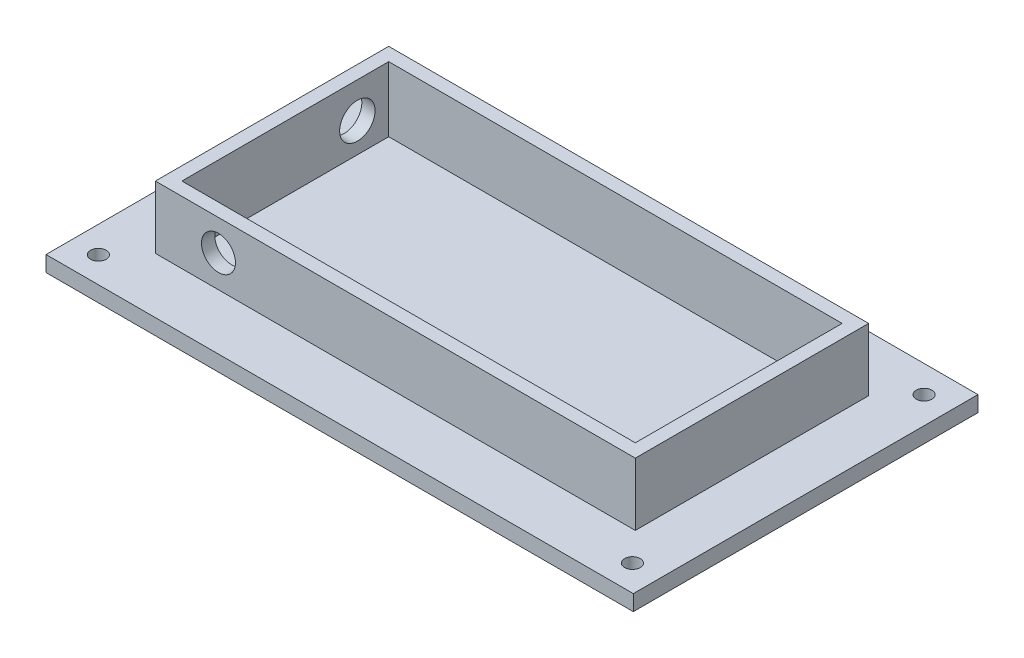
ISO-10303-21;
HEADER;
FILE_DESCRIPTION(('STEP AP214'),'2;1');
FILE_NAME('part.step','',(''),(''),'','','');
FILE_SCHEMA(('AUTOMOTIVE_DESIGN { 1 0 10303 214 1 1 1 1 }'));
ENDSEC;
DATA;
#1=APPLICATION_CONTEXT('core data for automotive mechanical design processes');
#2=APPLICATION_PROTOCOL_DEFINITION('international standard','automotive_design',2000,#1);
#3=PRODUCT_CONTEXT('',#1,'mechanical');
#4=PRODUCT('Part','Part','',(#3));
#5=PRODUCT_RELATED_PRODUCT_CATEGORY('part','',(#4));
#6=PRODUCT_DEFINITION_FORMATION('','',#4);
#7=PRODUCT_DEFINITION_CONTEXT('part definition',#1,'design');
#8=PRODUCT_DEFINITION('design','',#6,#7);
#9=PRODUCT_DEFINITION_SHAPE('','',#8);
#10=(LENGTH_UNIT() NAMED_UNIT(*) SI_UNIT(.MILLI.,.METRE.));
#11=(NAMED_UNIT(*) PLANE_ANGLE_UNIT() SI_UNIT($,.RADIAN.));
#12=(NAMED_UNIT(*) SI_UNIT($,.STERADIAN.) SOLID_ANGLE_UNIT());
#13=UNCERTAINTY_MEASURE_WITH_UNIT(LENGTH_MEASURE(1.E-05),#10,'distance_accuracy_value','');
#14=(GEOMETRIC_REPRESENTATION_CONTEXT(3) GLOBAL_UNCERTAINTY_ASSIGNED_CONTEXT((#13)) GLOBAL_UNIT_ASSIGNED_CONTEXT((#10,
#11,#12)) REPRESENTATION_CONTEXT('',''));
#15=CARTESIAN_POINT('',(0.,0.,0.));
#16=DIRECTION('',(0.,0.,1.));
#17=DIRECTION('',(1.,0.,0.));
#18=AXIS2_PLACEMENT_3D('',#15,#16,#17);
#19=CARTESIAN_POINT('',(-2.61848637797424,2.75093189925061,-3.54869754294544));
#20=DIRECTION('',(0.,1.,0.));
#21=DIRECTION('',(0.,0.,1.));
#22=AXIS2_PLACEMENT_3D('',#19,#20,#21);
#23=PLANE('',#22);
#24=DIRECTION('',(0.,0.,1.));
#25=VECTOR('',#24,1.);
#26=CARTESIAN_POINT('',(-64.0915115578303,2.75093189925061,-26.4032155285569));
#27=LINE('',#26,#25);
#28=CARTESIAN_POINT('',(-64.0915115578303,2.75093189925061,-26.4032155285569));
#29=VERTEX_POINT('',#28);
#30=CARTESIAN_POINT('',(-64.0915115578303,2.75093189925061,40.6527844714431));
#31=VERTEX_POINT('',#30);
#32=EDGE_CURVE('E69',#29,#31,#27,.T.);
#33=ORIENTED_EDGE('',*,*,#32,.F.);
#34=DIRECTION('',(1.,0.,0.));
#35=VECTOR('',#34,1.);
#36=CARTESIAN_POINT('',(-64.0915115578303,2.75093189925061,-26.4032155285569));
#37=LINE('',#36,#35);
#38=CARTESIAN_POINT('',(73.8304884421697,2.75093189925061,-26.4032155285569));
#39=VERTEX_POINT('',#38);
#40=EDGE_CURVE('E179',#29,#39,#37,.T.);
#41=ORIENTED_EDGE('',*,*,#40,.T.);
#42=DIRECTION('',(0.,0.,1.));
#43=VECTOR('',#42,1.);
#44=CARTESIAN_POINT('',(73.8304884421697,2.75093189925061,-26.4032155285569));
#45=LINE('',#44,#43);
#46=CARTESIAN_POINT('',(73.8304884421697,2.75093189925061,40.6527844714431));
#47=VERTEX_POINT('',#46);
#48=EDGE_CURVE('E189',#39,#47,#45,.T.);
#49=ORIENTED_EDGE('',*,*,#48,.T.);
#50=DIRECTION('',(1.,0.,0.));
#51=VECTOR('',#50,1.);
#52=CARTESIAN_POINT('',(-64.0915115578303,2.75093189925061,40.6527844714431));
#53=LINE('',#52,#51);
#54=EDGE_CURVE('E190',#31,#47,#53,.T.);
#55=ORIENTED_EDGE('',*,*,#54,.F.);
#56=EDGE_LOOP('',(#33,#41,#49,#55));
#57=FACE_BOUND('',#56,.T.);
#58=CARTESIAN_POINT('',(81.5320645135622,2.75093189925061,-34.6384759327261));
#59=DIRECTION('',(0.,1.,0.));
#60=DIRECTION('',(0.,0.,1.));
#61=AXIS2_PLACEMENT_3D('',#58,#59,#60);
#62=CIRCLE('',#61,2.25000000000001);
#63=CARTESIAN_POINT('',(81.5320645135622,2.75093189925061,-32.3884759327261));
#64=VERTEX_POINT('',#63);
#65=EDGE_CURVE('E209',#64,#64,#62,.T.);
#66=ORIENTED_EDGE('',*,*,#65,.F.);
#67=EDGE_LOOP('',(#66));
#68=FACE_BOUND('',#67,.T.);
#69=CARTESIAN_POINT('',(-71.9300990252795,2.75093189925061,-34.6384759327261));
#70=DIRECTION('',(0.,1.,0.));
#71=DIRECTION('',(0.,0.,1.));
#72=AXIS2_PLACEMENT_3D('',#69,#70,#71);
#73=CIRCLE('',#72,2.25000000000001);
#74=CARTESIAN_POINT('',(-71.9300990252795,2.75093189925061,-32.3884759327261));
#75=VERTEX_POINT('',#74);
#76=EDGE_CURVE('E225',#75,#75,#73,.T.);
#77=ORIENTED_EDGE('',*,*,#76,.F.);
#78=EDGE_LOOP('',(#77));
#79=FACE_BOUND('',#78,.T.);
#80=DIRECTION('',(0.,0.,1.));
#81=VECTOR('',#80,1.);
#82=CARTESIAN_POINT('',(-79.5220115578304,2.75093189925061,-42.4052155285569));
#83=LINE('',#82,#81);
#84=CARTESIAN_POINT('',(-79.5220115578304,2.75093189925061,-42.4052155285569));
#85=VERTEX_POINT('',#84);
#86=CARTESIAN_POINT('',(-79.5220115578303,2.75093189925061,56.6547844714431));
#87=VERTEX_POINT('',#86);
#88=EDGE_CURVE('E227',#85,#87,#83,.T.);
#89=ORIENTED_EDGE('',*,*,#88,.T.);
#90=DIRECTION('',(1.,0.,0.));
#91=VECTOR('',#90,1.);
#92=CARTESIAN_POINT('',(-79.5220115578303,2.75093189925061,56.6547844714431));
#93=LINE('',#92,#91);
#94=CARTESIAN_POINT('',(89.2609884421697,2.75093189925061,56.6547844714431));
#95=VERTEX_POINT('',#94);
#96=EDGE_CURVE('E232',#87,#95,#93,.T.);
#97=ORIENTED_EDGE('',*,*,#96,.T.);
#98=DIRECTION('',(0.,0.,-1.));
#99=VECTOR('',#98,1.);
#100=CARTESIAN_POINT('',(89.2609884421696,2.75093189925061,-42.4052155285569));
#101=LINE('',#100,#99);
#102=CARTESIAN_POINT('',(89.2609884421696,2.75093189925061,-42.4052155285569));
#103=VERTEX_POINT('',#102);
#104=EDGE_CURVE('E231',#95,#103,#101,.T.);
#105=ORIENTED_EDGE('',*,*,#104,.T.);
#106=DIRECTION('',(-1.,0.,0.));
#107=VECTOR('',#106,1.);
#108=CARTESIAN_POINT('',(-79.5220115578304,2.75093189925061,-42.4052155285569));
#109=LINE('',#108,#107);
#110=EDGE_CURVE('E237',#103,#85,#109,.T.);
#111=ORIENTED_EDGE('',*,*,#110,.T.);
#112=EDGE_LOOP('',(#89,#97,#105,#111));
#113=FACE_BOUND('',#112,.T.);
#114=CARTESIAN_POINT('',(81.5320645135622,2.75093189925061,49.1851880048192));
#115=DIRECTION('',(0.,1.,0.));
#116=DIRECTION('',(0.,0.,1.));
#117=AXIS2_PLACEMENT_3D('',#114,#115,#116);
#118=CIRCLE('',#117,2.25000000000001);
#119=CARTESIAN_POINT('',(81.5320645135622,2.75093189925061,51.4351880048192));
#120=VERTEX_POINT('',#119);
#121=EDGE_CURVE('E216',#120,#120,#118,.T.);
#122=ORIENTED_EDGE('',*,*,#121,.F.);
#123=EDGE_LOOP('',(#122));
#124=FACE_BOUND('',#123,.T.);
#125=CARTESIAN_POINT('',(-71.9300990252795,2.75093189925061,49.1851880048192));
#126=DIRECTION('',(0.,1.,0.));
#127=DIRECTION('',(0.,0.,1.));
#128=AXIS2_PLACEMENT_3D('',#125,#126,#127);
#129=CIRCLE('',#128,2.25000000000001);
#130=CARTESIAN_POINT('',(-71.9300990252795,2.75093189925061,51.4351880048192));
#131=VERTEX_POINT('',#130);
#132=EDGE_CURVE('E204',#131,#131,#129,.T.);
#133=ORIENTED_EDGE('',*,*,#132,.F.);
#134=EDGE_LOOP('',(#133));
#135=FACE_BOUND('',#134,.T.);
#136=ADVANCED_FACE('F45',(#57,#68,#79,#113,#124,#135),#23,.T.);
#137=CARTESIAN_POINT('',(-2.61848637797424,-1.74906810074939,-3.54869754294544));
#138=DIRECTION('',(0.,1.,0.));
#139=DIRECTION('',(0.,0.,1.));
#140=AXIS2_PLACEMENT_3D('',#137,#138,#139);
#141=PLANE('',#140);
#142=DIRECTION('',(0.,0.,1.));
#143=VECTOR('',#142,1.);
#144=CARTESIAN_POINT('',(-79.5220115578304,-1.74906810074939,-42.4052155285569));
#145=LINE('',#144,#143);
#146=CARTESIAN_POINT('',(-79.5220115578304,-1.74906810074939,-42.4052155285569));
#147=VERTEX_POINT('',#146);
#148=CARTESIAN_POINT('',(-79.5220115578303,-1.74906810074939,56.6547844714431));
#149=VERTEX_POINT('',#148);
#150=EDGE_CURVE('E223',#147,#149,#145,.T.);
#151=ORIENTED_EDGE('',*,*,#150,.F.);
#152=DIRECTION('',(-1.,0.,0.));
#153=VECTOR('',#152,1.);
#154=CARTESIAN_POINT('',(-79.5220115578304,-1.74906810074939,-42.4052155285569));
#155=LINE('',#154,#153);
#156=CARTESIAN_POINT('',(89.2609884421696,-1.74906810074939,-42.4052155285569));
#157=VERTEX_POINT('',#156);
#158=EDGE_CURVE('E234',#157,#147,#155,.T.);
#159=ORIENTED_EDGE('',*,*,#158,.F.);
#160=DIRECTION('',(0.,0.,-1.));
#161=VECTOR('',#160,1.);
#162=CARTESIAN_POINT('',(89.2609884421696,-1.74906810074939,-42.4052155285569));
#163=LINE('',#162,#161);
#164=CARTESIAN_POINT('',(89.2609884421697,-1.74906810074939,56.6547844714431));
#165=VERTEX_POINT('',#164);
#166=EDGE_CURVE('E242',#165,#157,#163,.T.);
#167=ORIENTED_EDGE('',*,*,#166,.F.);
#168=DIRECTION('',(1.,0.,0.));
#169=VECTOR('',#168,1.);
#170=CARTESIAN_POINT('',(-79.5220115578303,-1.74906810074939,56.6547844714431));
#171=LINE('',#170,#169);
#172=EDGE_CURVE('E241',#149,#165,#171,.T.);
#173=ORIENTED_EDGE('',*,*,#172,.F.);
#174=EDGE_LOOP('',(#151,#159,#167,#173));
#175=FACE_BOUND('',#174,.T.);
#176=CARTESIAN_POINT('',(-71.9300990252795,-1.74906810074939,-34.6384759327261));
#177=DIRECTION('',(0.,1.,0.));
#178=DIRECTION('',(0.,0.,1.));
#179=AXIS2_PLACEMENT_3D('',#176,#177,#178);
#180=CIRCLE('',#179,2.25000000000001);
#181=CARTESIAN_POINT('',(-71.9300990252795,-1.74906810074939,-32.3884759327261));
#182=VERTEX_POINT('',#181);
#183=EDGE_CURVE('E218',#182,#182,#180,.T.);
#184=ORIENTED_EDGE('',*,*,#183,.T.);
#185=EDGE_LOOP('',(#184));
#186=FACE_BOUND('',#185,.T.);
#187=CARTESIAN_POINT('',(81.5320645135622,-1.74906810074939,49.1851880048192));
#188=DIRECTION('',(0.,1.,0.));
#189=DIRECTION('',(0.,0.,1.));
#190=AXIS2_PLACEMENT_3D('',#187,#188,#189);
#191=CIRCLE('',#190,2.25000000000001);
#192=CARTESIAN_POINT('',(81.5320645135622,-1.74906810074939,51.4351880048192));
#193=VERTEX_POINT('',#192);
#194=EDGE_CURVE('E213',#193,#193,#191,.T.);
#195=ORIENTED_EDGE('',*,*,#194,.T.);
#196=EDGE_LOOP('',(#195));
#197=FACE_BOUND('',#196,.T.);
#198=CARTESIAN_POINT('',(81.5320645135622,-1.74906810074939,-34.6384759327261));
#199=DIRECTION('',(0.,1.,0.));
#200=DIRECTION('',(0.,0.,1.));
#201=AXIS2_PLACEMENT_3D('',#198,#199,#200);
#202=CIRCLE('',#201,2.25000000000001);
#203=CARTESIAN_POINT('',(81.5320645135622,-1.74906810074939,-32.3884759327261));
#204=VERTEX_POINT('',#203);
#205=EDGE_CURVE('E210',#204,#204,#202,.T.);
#206=ORIENTED_EDGE('',*,*,#205,.T.);
#207=EDGE_LOOP('',(#206));
#208=FACE_BOUND('',#207,.T.);
#209=CARTESIAN_POINT('',(-71.9300990252795,-1.74906810074939,49.1851880048192));
#210=DIRECTION('',(0.,1.,0.));
#211=DIRECTION('',(0.,0.,1.));
#212=AXIS2_PLACEMENT_3D('',#209,#210,#211);
#213=CIRCLE('',#212,2.25000000000001);
#214=CARTESIAN_POINT('',(-71.9300990252795,-1.74906810074939,51.4351880048192));
#215=VERTEX_POINT('',#214);
#216=EDGE_CURVE('E201',#215,#215,#213,.T.);
#217=ORIENTED_EDGE('',*,*,#216,.T.);
#218=EDGE_LOOP('',(#217));
#219=FACE_BOUND('',#218,.T.);
#220=ADVANCED_FACE('F282',(#175,#186,#197,#208,#219),#141,.F.);
#221=CARTESIAN_POINT('',(-79.5220115578304,2.75093189925061,-42.4052155285569));
#222=DIRECTION('',(1.,0.,0.));
#223=DIRECTION('',(0.,0.,-1.));
#224=AXIS2_PLACEMENT_3D('',#221,#222,#223);
#225=PLANE('',#224);
#226=ORIENTED_EDGE('',*,*,#150,.T.);
#227=DIRECTION('',(0.,-1.,0.));
#228=VECTOR('',#227,1.);
#229=CARTESIAN_POINT('',(-79.5220115578303,2.75093189925061,56.6547844714431));
#230=LINE('',#229,#228);
#231=EDGE_CURVE('E12',#87,#149,#230,.T.);
#232=ORIENTED_EDGE('',*,*,#231,.F.);
#233=ORIENTED_EDGE('',*,*,#88,.F.);
#234=DIRECTION('',(0.,-1.,0.));
#235=VECTOR('',#234,1.);
#236=CARTESIAN_POINT('',(-79.5220115578304,2.75093189925061,-42.4052155285569));
#237=LINE('',#236,#235);
#238=EDGE_CURVE('E236',#85,#147,#237,.T.);
#239=ORIENTED_EDGE('',*,*,#238,.T.);
#240=EDGE_LOOP('',(#226,#232,#233,#239));
#241=FACE_BOUND('',#240,.T.);
#242=ADVANCED_FACE('F42',(#241),#225,.F.);
#243=CARTESIAN_POINT('',(-79.5220115578303,2.75093189925061,56.6547844714431));
#244=DIRECTION('',(0.,0.,-1.));
#245=DIRECTION('',(-1.,0.,0.));
#246=AXIS2_PLACEMENT_3D('',#243,#244,#245);
#247=PLANE('',#246);
#248=ORIENTED_EDGE('',*,*,#172,.T.);
#249=DIRECTION('',(0.,-1.,0.));
#250=VECTOR('',#249,1.);
#251=CARTESIAN_POINT('',(89.2609884421697,2.75093189925061,56.6547844714431));
#252=LINE('',#251,#250);
#253=EDGE_CURVE('E51',#95,#165,#252,.T.);
#254=ORIENTED_EDGE('',*,*,#253,.F.);
#255=ORIENTED_EDGE('',*,*,#96,.F.);
#256=ORIENTED_EDGE('',*,*,#231,.T.);
#257=EDGE_LOOP('',(#248,#254,#255,#256));
#258=FACE_BOUND('',#257,.T.);
#259=ADVANCED_FACE('F302',(#258),#247,.F.);
#260=CARTESIAN_POINT('',(89.2609884421696,2.75093189925061,-42.4052155285569));
#261=DIRECTION('',(-1.,0.,0.));
#262=DIRECTION('',(0.,0.,1.));
#263=AXIS2_PLACEMENT_3D('',#260,#261,#262);
#264=PLANE('',#263);
#265=ORIENTED_EDGE('',*,*,#166,.T.);
#266=DIRECTION('',(0.,-1.,0.));
#267=VECTOR('',#266,1.);
#268=CARTESIAN_POINT('',(89.2609884421696,2.75093189925061,-42.4052155285569));
#269=LINE('',#268,#267);
#270=EDGE_CURVE('E250',#103,#157,#269,.T.);
#271=ORIENTED_EDGE('',*,*,#270,.F.);
#272=ORIENTED_EDGE('',*,*,#104,.F.);
#273=ORIENTED_EDGE('',*,*,#253,.T.);
#274=EDGE_LOOP('',(#265,#271,#272,#273));
#275=FACE_BOUND('',#274,.T.);
#276=ADVANCED_FACE('F297',(#275),#264,.F.);
#277=CARTESIAN_POINT('',(-79.5220115578304,2.75093189925061,-42.4052155285569));
#278=DIRECTION('',(0.,0.,1.));
#279=DIRECTION('',(1.,0.,0.));
#280=AXIS2_PLACEMENT_3D('',#277,#278,#279);
#281=PLANE('',#280);
#282=ORIENTED_EDGE('',*,*,#158,.T.);
#283=ORIENTED_EDGE('',*,*,#238,.F.);
#284=ORIENTED_EDGE('',*,*,#110,.F.);
#285=ORIENTED_EDGE('',*,*,#270,.T.);
#286=EDGE_LOOP('',(#282,#283,#284,#285));
#287=FACE_BOUND('',#286,.T.);
#288=ADVANCED_FACE('F293',(#287),#281,.F.);
#289=CARTESIAN_POINT('',(-71.9300990252795,2.75093189925061,-34.6384759327261));
#290=DIRECTION('',(0.,-1.,0.));
#291=DIRECTION('',(0.,0.,-1.));
#292=AXIS2_PLACEMENT_3D('',#289,#290,#291);
#293=CYLINDRICAL_SURFACE('',#292,2.25000000000001);
#294=ORIENTED_EDGE('',*,*,#76,.T.);
#295=EDGE_LOOP('',(#294));
#296=FACE_BOUND('',#295,.T.);
#297=ORIENTED_EDGE('',*,*,#183,.F.);
#298=EDGE_LOOP('',(#297));
#299=FACE_BOUND('',#298,.T.);
#300=ADVANCED_FACE('F295',(#296,#299),#293,.F.);
#301=CARTESIAN_POINT('',(81.5320645135622,2.75093189925061,49.1851880048192));
#302=DIRECTION('',(0.,-1.,0.));
#303=DIRECTION('',(0.,0.,-1.));
#304=AXIS2_PLACEMENT_3D('',#301,#302,#303);
#305=CYLINDRICAL_SURFACE('',#304,2.25000000000001);
#306=ORIENTED_EDGE('',*,*,#121,.T.);
#307=EDGE_LOOP('',(#306));
#308=FACE_BOUND('',#307,.T.);
#309=ORIENTED_EDGE('',*,*,#194,.F.);
#310=EDGE_LOOP('',(#309));
#311=FACE_BOUND('',#310,.T.);
#312=ADVANCED_FACE('F342',(#308,#311),#305,.F.);
#313=CARTESIAN_POINT('',(81.5320645135622,2.75093189925061,-34.6384759327261));
#314=DIRECTION('',(0.,-1.,0.));
#315=DIRECTION('',(0.,0.,-1.));
#316=AXIS2_PLACEMENT_3D('',#313,#314,#315);
#317=CYLINDRICAL_SURFACE('',#316,2.25000000000001);
#318=ORIENTED_EDGE('',*,*,#65,.T.);
#319=EDGE_LOOP('',(#318));
#320=FACE_BOUND('',#319,.T.);
#321=ORIENTED_EDGE('',*,*,#205,.F.);
#322=EDGE_LOOP('',(#321));
#323=FACE_BOUND('',#322,.T.);
#324=ADVANCED_FACE('F329',(#320,#323),#317,.F.);
#325=CARTESIAN_POINT('',(-71.9300990252795,2.75093189925061,49.1851880048192));
#326=DIRECTION('',(0.,-1.,0.));
#327=DIRECTION('',(0.,0.,-1.));
#328=AXIS2_PLACEMENT_3D('',#325,#326,#327);
#329=CYLINDRICAL_SURFACE('',#328,2.25000000000001);
#330=ORIENTED_EDGE('',*,*,#132,.T.);
#331=EDGE_LOOP('',(#330));
#332=FACE_BOUND('',#331,.T.);
#333=ORIENTED_EDGE('',*,*,#216,.F.);
#334=EDGE_LOOP('',(#333));
#335=FACE_BOUND('',#334,.T.);
#336=ADVANCED_FACE('F326',(#332,#335),#329,.F.);
#337=CARTESIAN_POINT('',(-64.0915115578303,20.7509318992506,-26.4032155285569));
#338=DIRECTION('',(1.,0.,0.));
#339=DIRECTION('',(0.,0.,-1.));
#340=AXIS2_PLACEMENT_3D('',#337,#338,#339);
#341=PLANE('',#340);
#342=CARTESIAN_POINT('',(-64.0915115578303,10.5470733162915,-13.5888155859573));
#343=DIRECTION('',(-1.,0.,0.));
#344=DIRECTION('',(0.,0.,1.));
#345=AXIS2_PLACEMENT_3D('',#342,#343,#344);
#346=CIRCLE('',#345,5.09074385037326);
#347=CARTESIAN_POINT('',(-64.0915115578303,10.5470733162915,-8.49807173558409));
#348=VERTEX_POINT('',#347);
#349=EDGE_CURVE('E261',#348,#348,#346,.T.);
#350=ORIENTED_EDGE('',*,*,#349,.F.);
#351=EDGE_LOOP('',(#350));
#352=FACE_BOUND('',#351,.T.);
#353=ORIENTED_EDGE('',*,*,#32,.T.);
#354=DIRECTION('',(0.,-1.,0.));
#355=VECTOR('',#354,1.);
#356=CARTESIAN_POINT('',(-64.0915115578303,20.7509318992506,40.6527844714431));
#357=LINE('',#356,#355);
#358=CARTESIAN_POINT('',(-64.0915115578303,20.7509318992506,40.6527844714431));
#359=VERTEX_POINT('',#358);
#360=EDGE_CURVE('E199',#359,#31,#357,.T.);
#361=ORIENTED_EDGE('',*,*,#360,.F.);
#362=DIRECTION('',(0.,0.,1.));
#363=VECTOR('',#362,1.);
#364=CARTESIAN_POINT('',(-64.0915115578303,20.7509318992506,-26.4032155285569));
#365=LINE('',#364,#363);
#366=CARTESIAN_POINT('',(-64.0915115578303,20.7509318992506,-26.4032155285569));
#367=VERTEX_POINT('',#366);
#368=EDGE_CURVE('E172',#367,#359,#365,.T.);
#369=ORIENTED_EDGE('',*,*,#368,.F.);
#370=DIRECTION('',(0.,-1.,0.));
#371=VECTOR('',#370,1.);
#372=CARTESIAN_POINT('',(-64.0915115578303,20.7509318992506,-26.4032155285569));
#373=LINE('',#372,#371);
#374=EDGE_CURVE('E183',#367,#29,#373,.T.);
#375=ORIENTED_EDGE('',*,*,#374,.T.);
#376=EDGE_LOOP('',(#353,#361,#369,#375));
#377=FACE_BOUND('',#376,.T.);
#378=ADVANCED_FACE('F328',(#352,#377),#341,.F.);
#379=CARTESIAN_POINT('',(-64.0915115578303,20.7509318992506,40.6527844714431));
#380=DIRECTION('',(0.,0.,-1.));
#381=DIRECTION('',(-1.,0.,0.));
#382=AXIS2_PLACEMENT_3D('',#379,#380,#381);
#383=PLANE('',#382);
#384=CARTESIAN_POINT('',(-45.9576627493145,11.9287226666821,40.6527844714431));
#385=DIRECTION('',(0.,0.,1.));
#386=DIRECTION('',(1.,0.,0.));
#387=AXIS2_PLACEMENT_3D('',#384,#385,#386);
#388=CIRCLE('',#387,4.88010987815133);
#389=CARTESIAN_POINT('',(-41.0775528711631,11.9287226666821,40.6527844714431));
#390=VERTEX_POINT('',#389);
#391=EDGE_CURVE('E251',#390,#390,#388,.T.);
#392=ORIENTED_EDGE('',*,*,#391,.F.);
#393=EDGE_LOOP('',(#392));
#394=FACE_BOUND('',#393,.T.);
#395=ORIENTED_EDGE('',*,*,#54,.T.);
#396=DIRECTION('',(0.,-1.,0.));
#397=VECTOR('',#396,1.);
#398=CARTESIAN_POINT('',(73.8304884421697,20.7509318992506,40.6527844714431));
#399=LINE('',#398,#397);
#400=CARTESIAN_POINT('',(73.8304884421697,20.7509318992506,40.6527844714431));
#401=VERTEX_POINT('',#400);
#402=EDGE_CURVE('E197',#401,#47,#399,.T.);
#403=ORIENTED_EDGE('',*,*,#402,.F.);
#404=DIRECTION('',(1.,0.,0.));
#405=VECTOR('',#404,1.);
#406=CARTESIAN_POINT('',(-64.0915115578303,20.7509318992506,40.6527844714431));
#407=LINE('',#406,#405);
#408=EDGE_CURVE('E177',#359,#401,#407,.T.);
#409=ORIENTED_EDGE('',*,*,#408,.F.);
#410=ORIENTED_EDGE('',*,*,#360,.T.);
#411=EDGE_LOOP('',(#395,#403,#409,#410));
#412=FACE_BOUND('',#411,.T.);
#413=ADVANCED_FACE('F337',(#394,#412),#383,.F.);
#414=CARTESIAN_POINT('',(73.8304884421697,20.7509318992506,-26.4032155285569));
#415=DIRECTION('',(1.,0.,0.));
#416=DIRECTION('',(0.,0.,-1.));
#417=AXIS2_PLACEMENT_3D('',#414,#415,#416);
#418=PLANE('',#417);
#419=ORIENTED_EDGE('',*,*,#48,.F.);
#420=DIRECTION('',(0.,-1.,0.));
#421=VECTOR('',#420,1.);
#422=CARTESIAN_POINT('',(73.8304884421697,20.7509318992506,-26.4032155285569));
#423=LINE('',#422,#421);
#424=CARTESIAN_POINT('',(73.8304884421697,20.7509318992506,-26.4032155285569));
#425=VERTEX_POINT('',#424);
#426=EDGE_CURVE('E191',#425,#39,#423,.T.);
#427=ORIENTED_EDGE('',*,*,#426,.F.);
#428=DIRECTION('',(0.,0.,1.));
#429=VECTOR('',#428,1.);
#430=CARTESIAN_POINT('',(73.8304884421697,20.7509318992506,-26.4032155285569));
#431=LINE('',#430,#429);
#432=EDGE_CURVE('E176',#425,#401,#431,.T.);
#433=ORIENTED_EDGE('',*,*,#432,.T.);
#434=ORIENTED_EDGE('',*,*,#402,.T.);
#435=EDGE_LOOP('',(#419,#427,#433,#434));
#436=FACE_BOUND('',#435,.T.);
#437=ADVANCED_FACE('F425',(#436),#418,.T.);
#438=CARTESIAN_POINT('',(-64.0915115578303,20.7509318992506,-26.4032155285569));
#439=DIRECTION('',(0.,0.,-1.));
#440=DIRECTION('',(-1.,0.,0.));
#441=AXIS2_PLACEMENT_3D('',#438,#439,#440);
#442=PLANE('',#441);
#443=ORIENTED_EDGE('',*,*,#40,.F.);
#444=ORIENTED_EDGE('',*,*,#374,.F.);
#445=DIRECTION('',(1.,0.,0.));
#446=VECTOR('',#445,1.);
#447=CARTESIAN_POINT('',(-64.0915115578303,20.7509318992506,-26.4032155285569));
#448=LINE('',#447,#446);
#449=EDGE_CURVE('E185',#367,#425,#448,.T.);
#450=ORIENTED_EDGE('',*,*,#449,.T.);
#451=ORIENTED_EDGE('',*,*,#426,.T.);
#452=EDGE_LOOP('',(#443,#444,#450,#451));
#453=FACE_BOUND('',#452,.T.);
#454=ADVANCED_FACE('F276',(#453),#442,.T.);
#455=CARTESIAN_POINT('',(-2.61848637797424,20.7509318992506,-3.54869754294544));
#456=DIRECTION('',(0.,1.,0.));
#457=DIRECTION('',(0.,0.,1.));
#458=AXIS2_PLACEMENT_3D('',#455,#456,#457);
#459=PLANE('',#458);
#460=DIRECTION('',(0.,0.,1.));
#461=VECTOR('',#460,1.);
#462=CARTESIAN_POINT('',(-60.2815115578303,20.7509318992506,-26.4032155285569));
#463=LINE('',#462,#461);
#464=CARTESIAN_POINT('',(-60.2815115578303,20.7509318992506,-22.5932155285569));
#465=VERTEX_POINT('',#464);
#466=CARTESIAN_POINT('',(-60.2815115578303,20.7509318992506,36.8427844714431));
#467=VERTEX_POINT('',#466);
#468=EDGE_CURVE('E134',#465,#467,#463,.T.);
#469=ORIENTED_EDGE('',*,*,#468,.F.);
#470=DIRECTION('',(1.,0.,0.));
#471=VECTOR('',#470,1.);
#472=CARTESIAN_POINT('',(-64.0915115578303,20.7509318992506,-22.5932155285569));
#473=LINE('',#472,#471);
#474=CARTESIAN_POINT('',(70.0204884421697,20.7509318992506,-22.5932155285569));
#475=VERTEX_POINT('',#474);
#476=EDGE_CURVE('E159',#465,#475,#473,.T.);
#477=ORIENTED_EDGE('',*,*,#476,.T.);
#478=DIRECTION('',(0.,0.,1.));
#479=VECTOR('',#478,1.);
#480=CARTESIAN_POINT('',(70.0204884421697,20.7509318992506,-26.4032155285569));
#481=LINE('',#480,#479);
#482=CARTESIAN_POINT('',(70.0204884421697,20.7509318992506,36.8427844714431));
#483=VERTEX_POINT('',#482);
#484=EDGE_CURVE('E56',#475,#483,#481,.T.);
#485=ORIENTED_EDGE('',*,*,#484,.T.);
#486=DIRECTION('',(1.,0.,0.));
#487=VECTOR('',#486,1.);
#488=CARTESIAN_POINT('',(-64.0915115578303,20.7509318992506,36.8427844714431));
#489=LINE('',#488,#487);
#490=EDGE_CURVE('E144',#467,#483,#489,.T.);
#491=ORIENTED_EDGE('',*,*,#490,.F.);
#492=EDGE_LOOP('',(#469,#477,#485,#491));
#493=FACE_BOUND('',#492,.T.);
#494=ORIENTED_EDGE('',*,*,#368,.T.);
#495=ORIENTED_EDGE('',*,*,#408,.T.);
#496=ORIENTED_EDGE('',*,*,#432,.F.);
#497=ORIENTED_EDGE('',*,*,#449,.F.);
#498=EDGE_LOOP('',(#494,#495,#496,#497));
#499=FACE_BOUND('',#498,.T.);
#500=ADVANCED_FACE('F160',(#493,#499),#459,.T.);
#501=CARTESIAN_POINT('',(-2.61848637797424,2.06093189925062,-3.54869754294544));
#502=DIRECTION('',(0.,1.,0.));
#503=DIRECTION('',(0.,0.,1.));
#504=AXIS2_PLACEMENT_3D('',#501,#502,#503);
#505=PLANE('',#504);
#506=DIRECTION('',(0.,0.,-1.));
#507=VECTOR('',#506,1.);
#508=CARTESIAN_POINT('',(70.0204884421697,2.06093189925062,-3.54869754294543));
#509=LINE('',#508,#507);
#510=CARTESIAN_POINT('',(70.0204884421697,2.06093189925062,36.8427844714431));
#511=VERTEX_POINT('',#510);
#512=CARTESIAN_POINT('',(70.0204884421697,2.06093189925062,-22.5932155285569));
#513=VERTEX_POINT('',#512);
#514=EDGE_CURVE('E166',#511,#513,#509,.T.);
#515=ORIENTED_EDGE('',*,*,#514,.T.);
#516=DIRECTION('',(-1.,0.,0.));
#517=VECTOR('',#516,1.);
#518=CARTESIAN_POINT('',(-2.61848637797424,2.06093189925062,-22.5932155285569));
#519=LINE('',#518,#517);
#520=CARTESIAN_POINT('',(-60.2815115578303,2.06093189925062,-22.5932155285569));
#521=VERTEX_POINT('',#520);
#522=EDGE_CURVE('E167',#513,#521,#519,.T.);
#523=ORIENTED_EDGE('',*,*,#522,.T.);
#524=DIRECTION('',(0.,0.,-1.));
#525=VECTOR('',#524,1.);
#526=CARTESIAN_POINT('',(-60.2815115578303,2.06093189925062,-3.54869754294543));
#527=LINE('',#526,#525);
#528=CARTESIAN_POINT('',(-60.2815115578303,2.06093189925062,36.8427844714431));
#529=VERTEX_POINT('',#528);
#530=EDGE_CURVE('E152',#529,#521,#527,.T.);
#531=ORIENTED_EDGE('',*,*,#530,.F.);
#532=DIRECTION('',(-1.,0.,0.));
#533=VECTOR('',#532,1.);
#534=CARTESIAN_POINT('',(-2.61848637797424,2.06093189925062,36.8427844714431));
#535=LINE('',#534,#533);
#536=EDGE_CURVE('E153',#511,#529,#535,.T.);
#537=ORIENTED_EDGE('',*,*,#536,.F.);
#538=EDGE_LOOP('',(#515,#523,#531,#537));
#539=FACE_BOUND('',#538,.T.);
#540=ADVANCED_FACE('F269',(#539),#505,.T.);
#541=CARTESIAN_POINT('',(-60.2815115578303,20.7509318992506,-26.4032155285569));
#542=DIRECTION('',(1.,0.,0.));
#543=DIRECTION('',(0.,0.,-1.));
#544=AXIS2_PLACEMENT_3D('',#541,#542,#543);
#545=PLANE('',#544);
#546=CARTESIAN_POINT('',(-60.2815115578303,10.5470733162915,-13.5888155859573));
#547=DIRECTION('',(1.,0.,0.));
#548=DIRECTION('',(0.,0.,-1.));
#549=AXIS2_PLACEMENT_3D('',#546,#547,#548);
#550=CIRCLE('',#549,5.09074385037326);
#551=CARTESIAN_POINT('',(-60.2815115578303,10.5470733162915,-18.6795594363306));
#552=VERTEX_POINT('',#551);
#553=EDGE_CURVE('E46',#552,#552,#550,.T.);
#554=ORIENTED_EDGE('',*,*,#553,.F.);
#555=EDGE_LOOP('',(#554));
#556=FACE_BOUND('',#555,.T.);
#557=ORIENTED_EDGE('',*,*,#530,.T.);
#558=DIRECTION('',(0.,-1.,0.));
#559=VECTOR('',#558,1.);
#560=CARTESIAN_POINT('',(-60.2815115578303,20.7509318992506,-22.5932155285569));
#561=LINE('',#560,#559);
#562=EDGE_CURVE('E138',#465,#521,#561,.T.);
#563=ORIENTED_EDGE('',*,*,#562,.F.);
#564=ORIENTED_EDGE('',*,*,#468,.T.);
#565=DIRECTION('',(0.,-1.,0.));
#566=VECTOR('',#565,1.);
#567=CARTESIAN_POINT('',(-60.2815115578303,20.7509318992506,36.8427844714431));
#568=LINE('',#567,#566);
#569=EDGE_CURVE('E140',#467,#529,#568,.T.);
#570=ORIENTED_EDGE('',*,*,#569,.T.);
#571=EDGE_LOOP('',(#557,#563,#564,#570));
#572=FACE_BOUND('',#571,.T.);
#573=ADVANCED_FACE('F139',(#556,#572),#545,.T.);
#574=CARTESIAN_POINT('',(-64.0915115578303,20.7509318992506,36.8427844714431));
#575=DIRECTION('',(0.,0.,-1.));
#576=DIRECTION('',(-1.,0.,0.));
#577=AXIS2_PLACEMENT_3D('',#574,#575,#576);
#578=PLANE('',#577);
#579=CARTESIAN_POINT('',(-45.9576627493145,11.9287226666821,36.8427844714431));
#580=DIRECTION('',(0.,0.,-1.));
#581=DIRECTION('',(-1.,0.,0.));
#582=AXIS2_PLACEMENT_3D('',#579,#580,#581);
#583=CIRCLE('',#582,4.88010987815133);
#584=CARTESIAN_POINT('',(-50.8377726274658,11.9287226666821,36.8427844714431));
#585=VERTEX_POINT('',#584);
#586=EDGE_CURVE('E148',#585,#585,#583,.T.);
#587=ORIENTED_EDGE('',*,*,#586,.F.);
#588=EDGE_LOOP('',(#587));
#589=FACE_BOUND('',#588,.T.);
#590=ORIENTED_EDGE('',*,*,#536,.T.);
#591=ORIENTED_EDGE('',*,*,#569,.F.);
#592=ORIENTED_EDGE('',*,*,#490,.T.);
#593=DIRECTION('',(0.,-1.,0.));
#594=VECTOR('',#593,1.);
#595=CARTESIAN_POINT('',(70.0204884421697,20.7509318992506,36.8427844714431));
#596=LINE('',#595,#594);
#597=EDGE_CURVE('E154',#483,#511,#596,.T.);
#598=ORIENTED_EDGE('',*,*,#597,.T.);
#599=EDGE_LOOP('',(#590,#591,#592,#598));
#600=FACE_BOUND('',#599,.T.);
#601=ADVANCED_FACE('F147',(#589,#600),#578,.T.);
#602=CARTESIAN_POINT('',(70.0204884421697,20.7509318992506,-26.4032155285569));
#603=DIRECTION('',(1.,0.,0.));
#604=DIRECTION('',(0.,0.,-1.));
#605=AXIS2_PLACEMENT_3D('',#602,#603,#604);
#606=PLANE('',#605);
#607=ORIENTED_EDGE('',*,*,#597,.F.);
#608=ORIENTED_EDGE('',*,*,#484,.F.);
#609=DIRECTION('',(0.,-1.,0.));
#610=VECTOR('',#609,1.);
#611=CARTESIAN_POINT('',(70.0204884421697,20.7509318992506,-22.5932155285569));
#612=LINE('',#611,#610);
#613=EDGE_CURVE('E264',#475,#513,#612,.T.);
#614=ORIENTED_EDGE('',*,*,#613,.T.);
#615=ORIENTED_EDGE('',*,*,#514,.F.);
#616=EDGE_LOOP('',(#607,#608,#614,#615));
#617=FACE_BOUND('',#616,.T.);
#618=ADVANCED_FACE('F266',(#617),#606,.F.);
#619=CARTESIAN_POINT('',(-64.0915115578303,20.7509318992506,-22.5932155285569));
#620=DIRECTION('',(0.,0.,-1.));
#621=DIRECTION('',(-1.,0.,0.));
#622=AXIS2_PLACEMENT_3D('',#619,#620,#621);
#623=PLANE('',#622);
#624=ORIENTED_EDGE('',*,*,#613,.F.);
#625=ORIENTED_EDGE('',*,*,#476,.F.);
#626=ORIENTED_EDGE('',*,*,#562,.T.);
#627=ORIENTED_EDGE('',*,*,#522,.F.);
#628=EDGE_LOOP('',(#624,#625,#626,#627));
#629=FACE_BOUND('',#628,.T.);
#630=ADVANCED_FACE('F268',(#629),#623,.F.);
#631=CARTESIAN_POINT('',(-45.9576627493145,11.9287226666821,28.3677844714431));
#632=DIRECTION('',(0.,0.,1.));
#633=DIRECTION('',(1.,0.,0.));
#634=AXIS2_PLACEMENT_3D('',#631,#632,#633);
#635=CYLINDRICAL_SURFACE('',#634,4.88010987815133);
#636=ORIENTED_EDGE('',*,*,#586,.T.);
#637=EDGE_LOOP('',(#636));
#638=FACE_BOUND('',#637,.T.);
#639=ORIENTED_EDGE('',*,*,#391,.T.);
#640=EDGE_LOOP('',(#639));
#641=FACE_BOUND('',#640,.T.);
#642=ADVANCED_FACE('F474',(#638,#641),#635,.F.);
#643=CARTESIAN_POINT('',(-51.8065115578304,10.5470733162915,-13.5888155859574));
#644=DIRECTION('',(-1.,0.,0.));
#645=DIRECTION('',(0.,0.,1.));
#646=AXIS2_PLACEMENT_3D('',#643,#644,#645);
#647=CYLINDRICAL_SURFACE('',#646,5.09074385037326);
#648=ORIENTED_EDGE('',*,*,#553,.T.);
#649=EDGE_LOOP('',(#648));
#650=FACE_BOUND('',#649,.T.);
#651=ORIENTED_EDGE('',*,*,#349,.T.);
#652=EDGE_LOOP('',(#651));
#653=FACE_BOUND('',#652,.T.);
#654=ADVANCED_FACE('F483',(#650,#653),#647,.F.);
#655=CLOSED_SHELL('',(#136,#220,#242,#259,#276,#288,#300,#312,#324,#336,#378,#413,#437,#454,
#500,#540,#573,#601,#618,#630,#642,#654));
#656=MANIFOLD_SOLID_BREP('B2',#655);
#657=ADVANCED_BREP_SHAPE_REPRESENTATION('',(#18,#656),#14);
#658=SHAPE_DEFINITION_REPRESENTATION(#9,#657);
ENDSEC;
END-ISO-10303-21;
